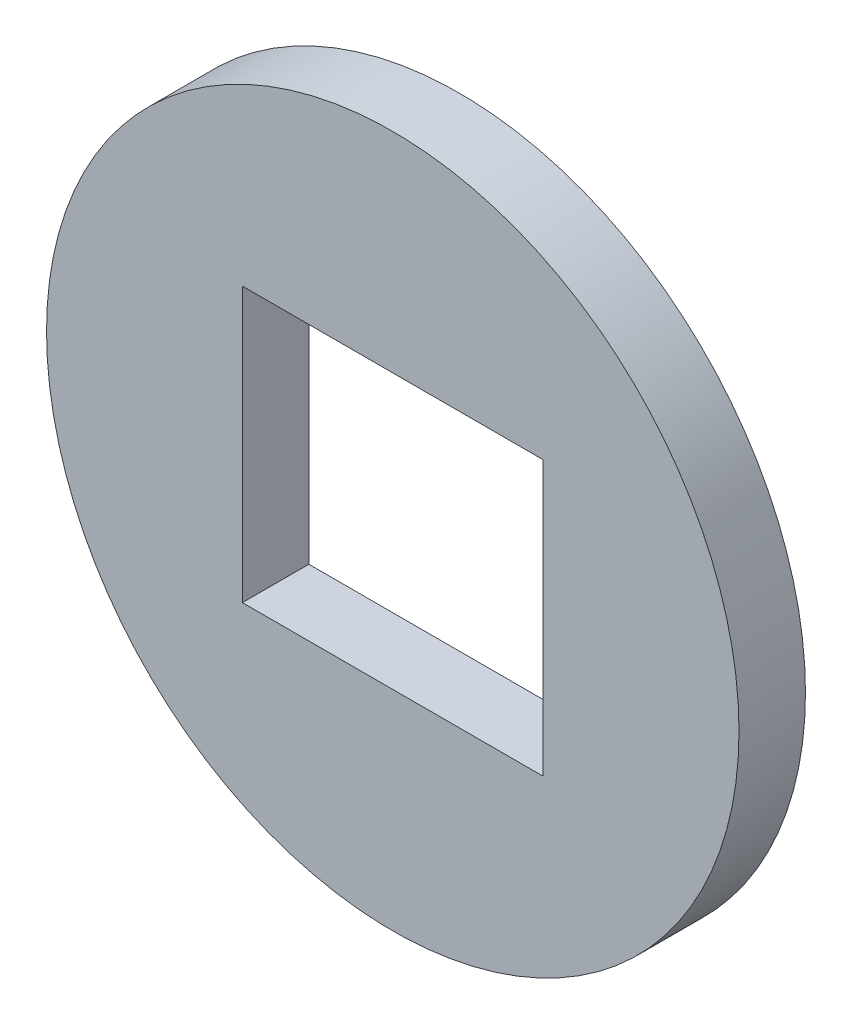
ISO-10303-21;
HEADER;
FILE_DESCRIPTION(('STEP AP214'),'2;1');
FILE_NAME('part.step','',(''),(''),'','','');
FILE_SCHEMA(('AUTOMOTIVE_DESIGN { 1 0 10303 214 1 1 1 1 }'));
ENDSEC;
DATA;
#1=APPLICATION_CONTEXT('core data for automotive mechanical design processes');
#2=APPLICATION_PROTOCOL_DEFINITION('international standard','automotive_design',2000,#1);
#3=PRODUCT_CONTEXT('',#1,'mechanical');
#4=PRODUCT('Part','Part','',(#3));
#5=PRODUCT_RELATED_PRODUCT_CATEGORY('part','',(#4));
#6=PRODUCT_DEFINITION_FORMATION('','',#4);
#7=PRODUCT_DEFINITION_CONTEXT('part definition',#1,'design');
#8=PRODUCT_DEFINITION('design','',#6,#7);
#9=PRODUCT_DEFINITION_SHAPE('','',#8);
#10=(LENGTH_UNIT() NAMED_UNIT(*) SI_UNIT(.MILLI.,.METRE.));
#11=(NAMED_UNIT(*) PLANE_ANGLE_UNIT() SI_UNIT($,.RADIAN.));
#12=(NAMED_UNIT(*) SI_UNIT($,.STERADIAN.) SOLID_ANGLE_UNIT());
#13=UNCERTAINTY_MEASURE_WITH_UNIT(LENGTH_MEASURE(1.E-05),#10,'distance_accuracy_value','');
#14=(GEOMETRIC_REPRESENTATION_CONTEXT(3) GLOBAL_UNCERTAINTY_ASSIGNED_CONTEXT((#13)) GLOBAL_UNIT_ASSIGNED_CONTEXT((#10,
#11,#12)) REPRESENTATION_CONTEXT('',''));
#15=CARTESIAN_POINT('',(0.,0.,0.));
#16=DIRECTION('',(0.,0.,1.));
#17=DIRECTION('',(1.,0.,0.));
#18=AXIS2_PLACEMENT_3D('',#15,#16,#17);
#19=CARTESIAN_POINT('',(0.,0.,10.));
#20=DIRECTION('',(0.,0.,-1.));
#21=DIRECTION('',(-1.,0.,0.));
#22=AXIS2_PLACEMENT_3D('',#19,#20,#21);
#23=CYLINDRICAL_SURFACE('',#22,52.1050521606765);
#24=CARTESIAN_POINT('',(0.,0.,10.));
#25=DIRECTION('',(0.,0.,1.));
#26=DIRECTION('',(1.,0.,0.));
#27=AXIS2_PLACEMENT_3D('',#24,#25,#26);
#28=CIRCLE('',#27,52.1050521606765);
#29=CARTESIAN_POINT('',(52.1050521606765,0.,10.));
#30=VERTEX_POINT('',#29);
#31=EDGE_CURVE('E11',#30,#30,#28,.T.);
#32=ORIENTED_EDGE('',*,*,#31,.F.);
#33=EDGE_LOOP('',(#32));
#34=FACE_BOUND('',#33,.T.);
#35=CARTESIAN_POINT('',(0.,0.,0.));
#36=DIRECTION('',(0.,0.,1.));
#37=DIRECTION('',(1.,0.,0.));
#38=AXIS2_PLACEMENT_3D('',#35,#36,#37);
#39=CIRCLE('',#38,52.1050521606765);
#40=CARTESIAN_POINT('',(52.1050521606765,0.,0.));
#41=VERTEX_POINT('',#40);
#42=EDGE_CURVE('E36',#41,#41,#39,.T.);
#43=ORIENTED_EDGE('',*,*,#42,.T.);
#44=EDGE_LOOP('',(#43));
#45=FACE_BOUND('',#44,.T.);
#46=ADVANCED_FACE('F33',(#34,#45),#23,.T.);
#47=CARTESIAN_POINT('',(0.,0.,10.));
#48=DIRECTION('',(0.,0.,1.));
#49=DIRECTION('',(1.,0.,0.));
#50=AXIS2_PLACEMENT_3D('',#47,#48,#49);
#51=PLANE('',#50);
#52=DIRECTION('',(0.,1.,0.));
#53=VECTOR('',#52,1.);
#54=CARTESIAN_POINT('',(22.6318266890092,-20.6241646440165,10.));
#55=LINE('',#54,#53);
#56=CARTESIAN_POINT('',(22.6318266890092,-20.6241646440165,10.));
#57=VERTEX_POINT('',#56);
#58=CARTESIAN_POINT('',(22.6318266890092,20.6241646440165,10.));
#59=VERTEX_POINT('',#58);
#60=EDGE_CURVE('E47',#57,#59,#55,.T.);
#61=ORIENTED_EDGE('',*,*,#60,.F.);
#62=DIRECTION('',(1.,0.,0.));
#63=VECTOR('',#62,1.);
#64=CARTESIAN_POINT('',(-22.6318266890092,-20.6241646440165,10.));
#65=LINE('',#64,#63);
#66=CARTESIAN_POINT('',(-22.6318266890092,-20.6241646440165,10.));
#67=VERTEX_POINT('',#66);
#68=EDGE_CURVE('E91',#67,#57,#65,.T.);
#69=ORIENTED_EDGE('',*,*,#68,.F.);
#70=DIRECTION('',(0.,-1.,0.));
#71=VECTOR('',#70,1.);
#72=CARTESIAN_POINT('',(-22.6318266890092,-20.6241646440165,10.));
#73=LINE('',#72,#71);
#74=CARTESIAN_POINT('',(-22.6318266890092,20.6241646440165,10.));
#75=VERTEX_POINT('',#74);
#76=EDGE_CURVE('E94',#75,#67,#73,.T.);
#77=ORIENTED_EDGE('',*,*,#76,.F.);
#78=DIRECTION('',(-1.,0.,0.));
#79=VECTOR('',#78,1.);
#80=CARTESIAN_POINT('',(-22.6318266890092,20.6241646440165,10.));
#81=LINE('',#80,#79);
#82=EDGE_CURVE('E100',#59,#75,#81,.T.);
#83=ORIENTED_EDGE('',*,*,#82,.F.);
#84=EDGE_LOOP('',(#61,#69,#77,#83));
#85=FACE_BOUND('',#84,.T.);
#86=ORIENTED_EDGE('',*,*,#31,.T.);
#87=EDGE_LOOP('',(#86));
#88=FACE_BOUND('',#87,.T.);
#89=ADVANCED_FACE('F112',(#85,#88),#51,.T.);
#90=CARTESIAN_POINT('',(0.,0.,0.));
#91=DIRECTION('',(0.,0.,1.));
#92=DIRECTION('',(1.,0.,0.));
#93=AXIS2_PLACEMENT_3D('',#90,#91,#92);
#94=PLANE('',#93);
#95=DIRECTION('',(1.,0.,0.));
#96=VECTOR('',#95,1.);
#97=CARTESIAN_POINT('',(-22.6318266890092,-20.6241646440165,0.));
#98=LINE('',#97,#96);
#99=CARTESIAN_POINT('',(-22.6318266890092,-20.6241646440165,0.));
#100=VERTEX_POINT('',#99);
#101=CARTESIAN_POINT('',(22.6318266890092,-20.6241646440165,0.));
#102=VERTEX_POINT('',#101);
#103=EDGE_CURVE('E81',#100,#102,#98,.T.);
#104=ORIENTED_EDGE('',*,*,#103,.T.);
#105=DIRECTION('',(0.,1.,0.));
#106=VECTOR('',#105,1.);
#107=CARTESIAN_POINT('',(22.6318266890092,-20.6241646440165,0.));
#108=LINE('',#107,#106);
#109=CARTESIAN_POINT('',(22.6318266890092,20.6241646440165,0.));
#110=VERTEX_POINT('',#109);
#111=EDGE_CURVE('E75',#102,#110,#108,.T.);
#112=ORIENTED_EDGE('',*,*,#111,.T.);
#113=DIRECTION('',(-1.,0.,0.));
#114=VECTOR('',#113,1.);
#115=CARTESIAN_POINT('',(-22.6318266890092,20.6241646440165,0.));
#116=LINE('',#115,#114);
#117=CARTESIAN_POINT('',(-22.6318266890092,20.6241646440165,0.));
#118=VERTEX_POINT('',#117);
#119=EDGE_CURVE('E84',#110,#118,#116,.T.);
#120=ORIENTED_EDGE('',*,*,#119,.T.);
#121=DIRECTION('',(0.,-1.,0.));
#122=VECTOR('',#121,1.);
#123=CARTESIAN_POINT('',(-22.6318266890092,-20.6241646440165,0.));
#124=LINE('',#123,#122);
#125=EDGE_CURVE('E55',#118,#100,#124,.T.);
#126=ORIENTED_EDGE('',*,*,#125,.T.);
#127=EDGE_LOOP('',(#104,#112,#120,#126));
#128=FACE_BOUND('',#127,.T.);
#129=ORIENTED_EDGE('',*,*,#42,.F.);
#130=EDGE_LOOP('',(#129));
#131=FACE_BOUND('',#130,.T.);
#132=ADVANCED_FACE('F88',(#128,#131),#94,.F.);
#133=CARTESIAN_POINT('',(22.6318266890092,-20.6241646440165,0.));
#134=DIRECTION('',(1.,0.,0.));
#135=DIRECTION('',(0.,0.,-1.));
#136=AXIS2_PLACEMENT_3D('',#133,#134,#135);
#137=PLANE('',#136);
#138=ORIENTED_EDGE('',*,*,#60,.T.);
#139=DIRECTION('',(0.,0.,1.));
#140=VECTOR('',#139,1.);
#141=CARTESIAN_POINT('',(22.6318266890092,20.6241646440165,0.));
#142=LINE('',#141,#140);
#143=EDGE_CURVE('E71',#110,#59,#142,.T.);
#144=ORIENTED_EDGE('',*,*,#143,.F.);
#145=ORIENTED_EDGE('',*,*,#111,.F.);
#146=DIRECTION('',(0.,0.,1.));
#147=VECTOR('',#146,1.);
#148=CARTESIAN_POINT('',(22.6318266890092,-20.6241646440165,0.));
#149=LINE('',#148,#147);
#150=EDGE_CURVE('E104',#102,#57,#149,.T.);
#151=ORIENTED_EDGE('',*,*,#150,.T.);
#152=EDGE_LOOP('',(#138,#144,#145,#151));
#153=FACE_BOUND('',#152,.T.);
#154=ADVANCED_FACE('F73',(#153),#137,.F.);
#155=CARTESIAN_POINT('',(-22.6318266890092,-20.6241646440165,0.));
#156=DIRECTION('',(0.,-1.,0.));
#157=DIRECTION('',(0.,0.,-1.));
#158=AXIS2_PLACEMENT_3D('',#155,#156,#157);
#159=PLANE('',#158);
#160=ORIENTED_EDGE('',*,*,#68,.T.);
#161=ORIENTED_EDGE('',*,*,#150,.F.);
#162=ORIENTED_EDGE('',*,*,#103,.F.);
#163=DIRECTION('',(0.,0.,1.));
#164=VECTOR('',#163,1.);
#165=CARTESIAN_POINT('',(-22.6318266890092,-20.6241646440165,0.));
#166=LINE('',#165,#164);
#167=EDGE_CURVE('E106',#100,#67,#166,.T.);
#168=ORIENTED_EDGE('',*,*,#167,.T.);
#169=EDGE_LOOP('',(#160,#161,#162,#168));
#170=FACE_BOUND('',#169,.T.);
#171=ADVANCED_FACE('F115',(#170),#159,.F.);
#172=CARTESIAN_POINT('',(-22.6318266890092,-20.6241646440165,0.));
#173=DIRECTION('',(-1.,0.,0.));
#174=DIRECTION('',(0.,0.,1.));
#175=AXIS2_PLACEMENT_3D('',#172,#173,#174);
#176=PLANE('',#175);
#177=ORIENTED_EDGE('',*,*,#76,.T.);
#178=ORIENTED_EDGE('',*,*,#167,.F.);
#179=ORIENTED_EDGE('',*,*,#125,.F.);
#180=DIRECTION('',(0.,0.,1.));
#181=VECTOR('',#180,1.);
#182=CARTESIAN_POINT('',(-22.6318266890092,20.6241646440165,0.));
#183=LINE('',#182,#181);
#184=EDGE_CURVE('E80',#118,#75,#183,.T.);
#185=ORIENTED_EDGE('',*,*,#184,.T.);
#186=EDGE_LOOP('',(#177,#178,#179,#185));
#187=FACE_BOUND('',#186,.T.);
#188=ADVANCED_FACE('F108',(#187),#176,.F.);
#189=CARTESIAN_POINT('',(-22.6318266890092,20.6241646440165,0.));
#190=DIRECTION('',(0.,1.,0.));
#191=DIRECTION('',(0.,0.,1.));
#192=AXIS2_PLACEMENT_3D('',#189,#190,#191);
#193=PLANE('',#192);
#194=ORIENTED_EDGE('',*,*,#82,.T.);
#195=ORIENTED_EDGE('',*,*,#184,.F.);
#196=ORIENTED_EDGE('',*,*,#119,.F.);
#197=ORIENTED_EDGE('',*,*,#143,.T.);
#198=EDGE_LOOP('',(#194,#195,#196,#197));
#199=FACE_BOUND('',#198,.T.);
#200=ADVANCED_FACE('F85',(#199),#193,.F.);
#201=CLOSED_SHELL('',(#46,#89,#132,#154,#171,#188,#200));
#202=MANIFOLD_SOLID_BREP('B2',#201);
#203=ADVANCED_BREP_SHAPE_REPRESENTATION('',(#18,#202),#14);
#204=SHAPE_DEFINITION_REPRESENTATION(#9,#203);
ENDSEC;
END-ISO-10303-21;
